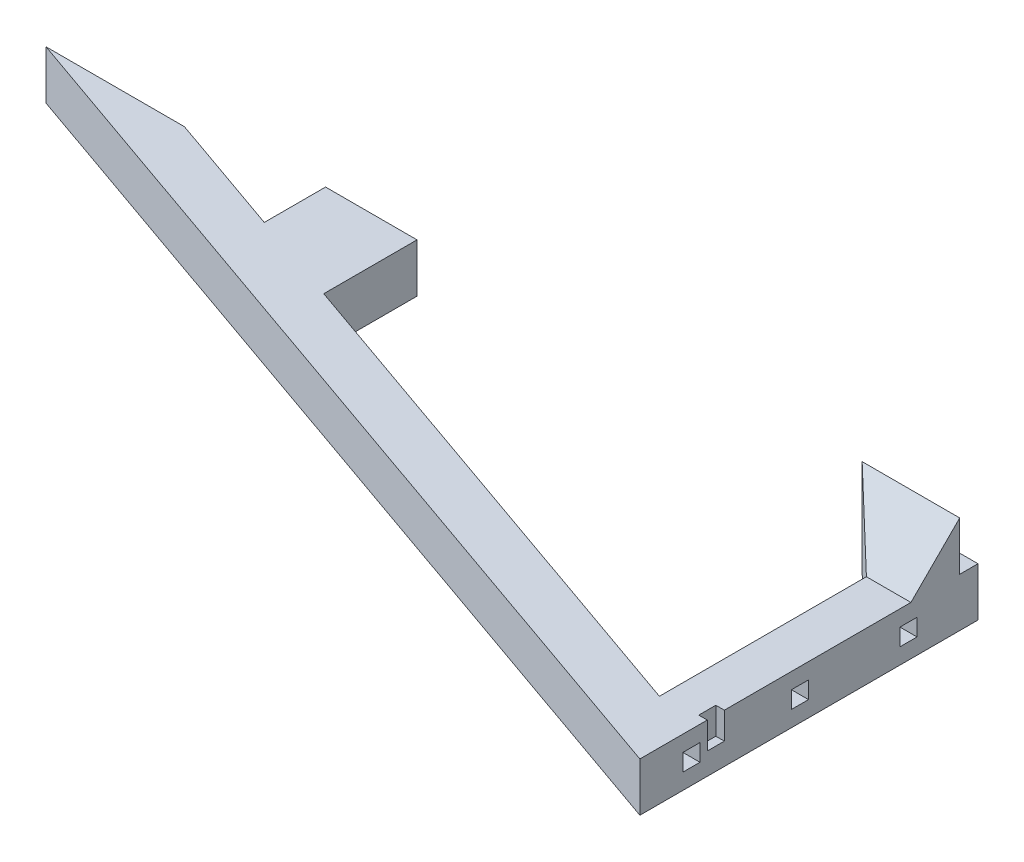
ISO-10303-21;
HEADER;
FILE_DESCRIPTION(('STEP AP214'),'2;1');
FILE_NAME('part.step','',(''),(''),'','','');
FILE_SCHEMA(('AUTOMOTIVE_DESIGN { 1 0 10303 214 1 1 1 1 }'));
ENDSEC;
DATA;
#1=APPLICATION_CONTEXT('core data for automotive mechanical design processes');
#2=APPLICATION_PROTOCOL_DEFINITION('international standard','automotive_design',2000,#1);
#3=PRODUCT_CONTEXT('',#1,'mechanical');
#4=PRODUCT('Part','Part','',(#3));
#5=PRODUCT_RELATED_PRODUCT_CATEGORY('part','',(#4));
#6=PRODUCT_DEFINITION_FORMATION('','',#4);
#7=PRODUCT_DEFINITION_CONTEXT('part definition',#1,'design');
#8=PRODUCT_DEFINITION('design','',#6,#7);
#9=PRODUCT_DEFINITION_SHAPE('','',#8);
#10=(LENGTH_UNIT() NAMED_UNIT(*) SI_UNIT(.MILLI.,.METRE.));
#11=(NAMED_UNIT(*) PLANE_ANGLE_UNIT() SI_UNIT($,.RADIAN.));
#12=(NAMED_UNIT(*) SI_UNIT($,.STERADIAN.) SOLID_ANGLE_UNIT());
#13=UNCERTAINTY_MEASURE_WITH_UNIT(LENGTH_MEASURE(1.E-05),#10,'distance_accuracy_value','');
#14=(GEOMETRIC_REPRESENTATION_CONTEXT(3) GLOBAL_UNCERTAINTY_ASSIGNED_CONTEXT((#13)) GLOBAL_UNIT_ASSIGNED_CONTEXT((#10,
#11,#12)) REPRESENTATION_CONTEXT('',''));
#15=CARTESIAN_POINT('',(0.,0.,0.));
#16=DIRECTION('',(0.,0.,1.));
#17=DIRECTION('',(1.,0.,0.));
#18=AXIS2_PLACEMENT_3D('',#15,#16,#17);
#19=CARTESIAN_POINT('',(-7.3,8.,44.9487293378726));
#20=DIRECTION('',(1.,0.,0.));
#21=DIRECTION('',(0.,0.,-1.));
#22=AXIS2_PLACEMENT_3D('',#19,#20,#21);
#23=PLANE('',#22);
#24=DIRECTION('',(0.,0.,1.));
#25=VECTOR('',#24,1.);
#26=CARTESIAN_POINT('',(-7.3,8.,44.9487293378726));
#27=LINE('',#26,#25);
#28=CARTESIAN_POINT('',(-7.3,8.,11.));
#29=VERTEX_POINT('',#28);
#30=CARTESIAN_POINT('',(-7.3,8.,44.9487293378726));
#31=VERTEX_POINT('',#30);
#32=EDGE_CURVE('E393',#29,#31,#27,.T.);
#33=ORIENTED_EDGE('',*,*,#32,.F.);
#34=DIRECTION('',(0.,-1.,0.));
#35=VECTOR('',#34,1.);
#36=CARTESIAN_POINT('',(-7.3,8.,11.));
#37=LINE('',#36,#35);
#38=CARTESIAN_POINT('',(-7.3,0.,11.));
#39=VERTEX_POINT('',#38);
#40=EDGE_CURVE('E358',#29,#39,#37,.T.);
#41=ORIENTED_EDGE('',*,*,#40,.T.);
#42=DIRECTION('',(0.,0.,1.));
#43=VECTOR('',#42,1.);
#44=CARTESIAN_POINT('',(-7.3,0.,44.9487293378726));
#45=LINE('',#44,#43);
#46=CARTESIAN_POINT('',(-7.3,0.,44.9487293378726));
#47=VERTEX_POINT('',#46);
#48=EDGE_CURVE('E420',#39,#47,#45,.T.);
#49=ORIENTED_EDGE('',*,*,#48,.T.);
#50=DIRECTION('',(0.,-1.,0.));
#51=VECTOR('',#50,1.);
#52=CARTESIAN_POINT('',(-7.3,8.,44.9487293378726));
#53=LINE('',#52,#51);
#54=EDGE_CURVE('E462',#31,#47,#53,.T.);
#55=ORIENTED_EDGE('',*,*,#54,.F.);
#56=EDGE_LOOP('',(#33,#41,#49,#55));
#57=FACE_BOUND('',#56,.T.);
#58=ADVANCED_FACE('F33',(#57),#23,.F.);
#59=CARTESIAN_POINT('',(0.,8.,0.));
#60=DIRECTION('',(0.,-1.,0.));
#61=DIRECTION('',(0.,0.,-1.));
#62=AXIS2_PLACEMENT_3D('',#59,#60,#61);
#63=PLANE('',#62);
#64=DIRECTION('',(0.,0.,-1.));
#65=VECTOR('',#64,1.);
#66=CARTESIAN_POINT('',(-92.,8.,0.));
#67=LINE('',#66,#65);
#68=CARTESIAN_POINT('',(-92.,8.,15.3023162581262));
#69=VERTEX_POINT('',#68);
#70=CARTESIAN_POINT('',(-92.,8.,0.));
#71=VERTEX_POINT('',#70);
#72=EDGE_CURVE('E400',#69,#71,#67,.T.);
#73=ORIENTED_EDGE('',*,*,#72,.T.);
#74=DIRECTION('',(-1.,0.,0.));
#75=VECTOR('',#74,1.);
#76=CARTESIAN_POINT('',(-107.,8.,0.));
#77=LINE('',#76,#75);
#78=CARTESIAN_POINT('',(-107.,8.,0.));
#79=VERTEX_POINT('',#78);
#80=EDGE_CURVE('E402',#71,#79,#77,.T.);
#81=ORIENTED_EDGE('',*,*,#80,.T.);
#82=DIRECTION('',(0.,0.,1.));
#83=VECTOR('',#82,1.);
#84=CARTESIAN_POINT('',(-107.,8.,10.0520660078759));
#85=LINE('',#84,#83);
#86=CARTESIAN_POINT('',(-107.,8.,10.0520660078759));
#87=VERTEX_POINT('',#86);
#88=EDGE_CURVE('E404',#79,#87,#85,.T.);
#89=ORIENTED_EDGE('',*,*,#88,.T.);
#90=DIRECTION('',(-0.943853446397098,0.,-0.330364452876395));
#91=VECTOR('',#90,1.);
#92=CARTESIAN_POINT('',(-127.147799643093,8.,3.));
#93=LINE('',#92,#91);
#94=CARTESIAN_POINT('',(-127.147799643093,8.,3.));
#95=VERTEX_POINT('',#94);
#96=EDGE_CURVE('E406',#87,#95,#93,.T.);
#97=ORIENTED_EDGE('',*,*,#96,.T.);
#98=DIRECTION('',(-1.,0.,0.));
#99=VECTOR('',#98,1.);
#100=CARTESIAN_POINT('',(-149.85,8.,3.));
#101=LINE('',#100,#99);
#102=CARTESIAN_POINT('',(-149.85,8.,3.));
#103=VERTEX_POINT('',#102);
#104=EDGE_CURVE('E408',#95,#103,#101,.T.);
#105=ORIENTED_EDGE('',*,*,#104,.T.);
#106=DIRECTION('',(0.943853446397098,0.,0.330364452876395));
#107=VECTOR('',#106,1.);
#108=CARTESIAN_POINT('',(0.,8.,55.45));
#109=LINE('',#108,#107);
#110=CARTESIAN_POINT('',(0.,8.,55.45));
#111=VERTEX_POINT('',#110);
#112=EDGE_CURVE('E410',#103,#111,#109,.T.);
#113=ORIENTED_EDGE('',*,*,#112,.T.);
#114=DIRECTION('',(0.,0.,-1.));
#115=VECTOR('',#114,1.);
#116=CARTESIAN_POINT('',(0.,8.,0.));
#117=LINE('',#116,#115);
#118=CARTESIAN_POINT('',(0.,8.,44.4));
#119=VERTEX_POINT('',#118);
#120=EDGE_CURVE('E413',#111,#119,#117,.T.);
#121=ORIENTED_EDGE('',*,*,#120,.T.);
#122=DIRECTION('',(1.,0.,0.));
#123=VECTOR('',#122,1.);
#124=CARTESIAN_POINT('',(-1.39999999999999,8.,44.4));
#125=LINE('',#124,#123);
#126=CARTESIAN_POINT('',(-1.39999999999999,8.,44.4));
#127=VERTEX_POINT('',#126);
#128=EDGE_CURVE('E376',#127,#119,#125,.T.);
#129=ORIENTED_EDGE('',*,*,#128,.F.);
#130=DIRECTION('',(0.,0.,1.));
#131=VECTOR('',#130,1.);
#132=CARTESIAN_POINT('',(-1.39999999999999,8.,41.6));
#133=LINE('',#132,#131);
#134=CARTESIAN_POINT('',(-1.39999999999999,8.,41.6));
#135=VERTEX_POINT('',#134);
#136=EDGE_CURVE('E361',#135,#127,#133,.T.);
#137=ORIENTED_EDGE('',*,*,#136,.F.);
#138=DIRECTION('',(-1.,0.,0.));
#139=VECTOR('',#138,1.);
#140=CARTESIAN_POINT('',(-1.39999999999999,8.,41.6));
#141=LINE('',#140,#139);
#142=CARTESIAN_POINT('',(0.,8.,41.6));
#143=VERTEX_POINT('',#142);
#144=EDGE_CURVE('E366',#143,#135,#141,.T.);
#145=ORIENTED_EDGE('',*,*,#144,.F.);
#146=CARTESIAN_POINT('',(0.,8.,11.));
#147=VERTEX_POINT('',#146);
#148=EDGE_CURVE('E417',#143,#147,#117,.T.);
#149=ORIENTED_EDGE('',*,*,#148,.T.);
#150=DIRECTION('',(-1.,0.,0.));
#151=VECTOR('',#150,1.);
#152=CARTESIAN_POINT('',(0.,8.,11.));
#153=LINE('',#152,#151);
#154=EDGE_CURVE('E355',#147,#29,#153,.T.);
#155=ORIENTED_EDGE('',*,*,#154,.T.);
#156=ORIENTED_EDGE('',*,*,#32,.T.);
#157=DIRECTION('',(-0.943853446397098,0.,-0.330364452876395));
#158=VECTOR('',#157,1.);
#159=CARTESIAN_POINT('',(-92.,8.,15.3023162581262));
#160=LINE('',#159,#158);
#161=EDGE_CURVE('E398',#31,#69,#160,.T.);
#162=ORIENTED_EDGE('',*,*,#161,.T.);
#163=EDGE_LOOP('',(#73,#81,#89,#97,#105,#113,#121,#129,#137,#145,#149,#155,#156,#162));
#164=FACE_BOUND('',#163,.T.);
#165=ADVANCED_FACE('F532',(#164),#63,.F.);
#166=CARTESIAN_POINT('',(-7.3,8.,0.));
#167=DIRECTION('',(0.,0.,1.));
#168=DIRECTION('',(1.,0.,0.));
#169=AXIS2_PLACEMENT_3D('',#166,#167,#168);
#170=PLANE('',#169);
#171=DIRECTION('',(-1.,0.,0.));
#172=VECTOR('',#171,1.);
#173=CARTESIAN_POINT('',(-7.3,0.,0.));
#174=LINE('',#173,#172);
#175=CARTESIAN_POINT('',(0.,0.,0.));
#176=VERTEX_POINT('',#175);
#177=CARTESIAN_POINT('',(-7.3,0.,0.));
#178=VERTEX_POINT('',#177);
#179=EDGE_CURVE('E382',#176,#178,#174,.T.);
#180=ORIENTED_EDGE('',*,*,#179,.T.);
#181=DIRECTION('',(0.,-1.,0.));
#182=VECTOR('',#181,1.);
#183=CARTESIAN_POINT('',(-7.3,8.,0.));
#184=LINE('',#183,#182);
#185=CARTESIAN_POINT('',(-7.3,8.,0.));
#186=VERTEX_POINT('',#185);
#187=EDGE_CURVE('E41',#186,#178,#184,.T.);
#188=ORIENTED_EDGE('',*,*,#187,.F.);
#189=DIRECTION('',(-1.,0.,0.));
#190=VECTOR('',#189,1.);
#191=CARTESIAN_POINT('',(-7.3,8.,0.));
#192=LINE('',#191,#190);
#193=CARTESIAN_POINT('',(0.,8.,0.));
#194=VERTEX_POINT('',#193);
#195=EDGE_CURVE('E390',#194,#186,#192,.T.);
#196=ORIENTED_EDGE('',*,*,#195,.F.);
#197=DIRECTION('',(0.,-1.,0.));
#198=VECTOR('',#197,1.);
#199=CARTESIAN_POINT('',(0.,8.,0.));
#200=LINE('',#199,#198);
#201=EDGE_CURVE('E416',#194,#176,#200,.T.);
#202=ORIENTED_EDGE('',*,*,#201,.T.);
#203=EDGE_LOOP('',(#180,#188,#196,#202));
#204=FACE_BOUND('',#203,.T.);
#205=ADVANCED_FACE('F35',(#204),#170,.F.);
#206=CARTESIAN_POINT('',(-7.3,0.,3.));
#207=VERTEX_POINT('',#206);
#208=EDGE_CURVE('E421',#178,#207,#45,.T.);
#209=ORIENTED_EDGE('',*,*,#208,.T.);
#210=DIRECTION('',(0.,1.,0.));
#211=VECTOR('',#210,1.);
#212=CARTESIAN_POINT('',(-7.3,8.,3.));
#213=LINE('',#212,#211);
#214=CARTESIAN_POINT('',(-7.3,8.,3.));
#215=VERTEX_POINT('',#214);
#216=EDGE_CURVE('E352',#207,#215,#213,.T.);
#217=ORIENTED_EDGE('',*,*,#216,.T.);
#218=EDGE_CURVE('E395',#186,#215,#27,.T.);
#219=ORIENTED_EDGE('',*,*,#218,.F.);
#220=ORIENTED_EDGE('',*,*,#187,.T.);
#221=EDGE_LOOP('',(#209,#217,#219,#220));
#222=FACE_BOUND('',#221,.T.);
#223=ADVANCED_FACE('F467',(#222),#23,.F.);
#224=CARTESIAN_POINT('',(-92.,8.,15.3023162581262));
#225=DIRECTION('',(-0.330364452876395,0.,0.943853446397098));
#226=DIRECTION('',(0.943853446397098,0.,0.330364452876395));
#227=AXIS2_PLACEMENT_3D('',#224,#225,#226);
#228=PLANE('',#227);
#229=DIRECTION('',(-0.943853446397098,0.,-0.330364452876395));
#230=VECTOR('',#229,1.);
#231=CARTESIAN_POINT('',(-92.,0.,15.3023162581262));
#232=LINE('',#231,#230);
#233=CARTESIAN_POINT('',(-92.,0.,15.3023162581262));
#234=VERTEX_POINT('',#233);
#235=EDGE_CURVE('E424',#47,#234,#232,.T.);
#236=ORIENTED_EDGE('',*,*,#235,.T.);
#237=DIRECTION('',(0.,-1.,0.));
#238=VECTOR('',#237,1.);
#239=CARTESIAN_POINT('',(-92.,8.,15.3023162581262));
#240=LINE('',#239,#238);
#241=EDGE_CURVE('E459',#69,#234,#240,.T.);
#242=ORIENTED_EDGE('',*,*,#241,.F.);
#243=ORIENTED_EDGE('',*,*,#161,.F.);
#244=ORIENTED_EDGE('',*,*,#54,.T.);
#245=EDGE_LOOP('',(#236,#242,#243,#244));
#246=FACE_BOUND('',#245,.T.);
#247=ADVANCED_FACE('F521',(#246),#228,.F.);
#248=CARTESIAN_POINT('',(-92.,8.,0.));
#249=DIRECTION('',(-1.,0.,0.));
#250=DIRECTION('',(0.,0.,1.));
#251=AXIS2_PLACEMENT_3D('',#248,#249,#250);
#252=PLANE('',#251);
#253=DIRECTION('',(0.,0.,-1.));
#254=VECTOR('',#253,1.);
#255=CARTESIAN_POINT('',(-92.,0.,0.));
#256=LINE('',#255,#254);
#257=CARTESIAN_POINT('',(-92.,0.,0.));
#258=VERTEX_POINT('',#257);
#259=EDGE_CURVE('E426',#234,#258,#256,.T.);
#260=ORIENTED_EDGE('',*,*,#259,.T.);
#261=DIRECTION('',(0.,-1.,0.));
#262=VECTOR('',#261,1.);
#263=CARTESIAN_POINT('',(-92.,8.,0.));
#264=LINE('',#263,#262);
#265=EDGE_CURVE('E456',#71,#258,#264,.T.);
#266=ORIENTED_EDGE('',*,*,#265,.F.);
#267=ORIENTED_EDGE('',*,*,#72,.F.);
#268=ORIENTED_EDGE('',*,*,#241,.T.);
#269=EDGE_LOOP('',(#260,#266,#267,#268));
#270=FACE_BOUND('',#269,.T.);
#271=ADVANCED_FACE('F517',(#270),#252,.F.);
#272=CARTESIAN_POINT('',(-107.,8.,0.));
#273=DIRECTION('',(0.,0.,1.));
#274=DIRECTION('',(1.,0.,0.));
#275=AXIS2_PLACEMENT_3D('',#272,#273,#274);
#276=PLANE('',#275);
#277=DIRECTION('',(-1.,0.,0.));
#278=VECTOR('',#277,1.);
#279=CARTESIAN_POINT('',(-107.,0.,0.));
#280=LINE('',#279,#278);
#281=CARTESIAN_POINT('',(-107.,0.,0.));
#282=VERTEX_POINT('',#281);
#283=EDGE_CURVE('E428',#258,#282,#280,.T.);
#284=ORIENTED_EDGE('',*,*,#283,.T.);
#285=DIRECTION('',(0.,-1.,0.));
#286=VECTOR('',#285,1.);
#287=CARTESIAN_POINT('',(-107.,8.,0.));
#288=LINE('',#287,#286);
#289=EDGE_CURVE('E453',#79,#282,#288,.T.);
#290=ORIENTED_EDGE('',*,*,#289,.F.);
#291=ORIENTED_EDGE('',*,*,#80,.F.);
#292=ORIENTED_EDGE('',*,*,#265,.T.);
#293=EDGE_LOOP('',(#284,#290,#291,#292));
#294=FACE_BOUND('',#293,.T.);
#295=ADVANCED_FACE('F512',(#294),#276,.F.);
#296=CARTESIAN_POINT('',(-107.,8.,10.0520660078759));
#297=DIRECTION('',(1.,0.,0.));
#298=DIRECTION('',(0.,0.,-1.));
#299=AXIS2_PLACEMENT_3D('',#296,#297,#298);
#300=PLANE('',#299);
#301=DIRECTION('',(0.,0.,1.));
#302=VECTOR('',#301,1.);
#303=CARTESIAN_POINT('',(-107.,0.,10.0520660078759));
#304=LINE('',#303,#302);
#305=CARTESIAN_POINT('',(-107.,0.,10.0520660078759));
#306=VERTEX_POINT('',#305);
#307=EDGE_CURVE('E430',#282,#306,#304,.T.);
#308=ORIENTED_EDGE('',*,*,#307,.T.);
#309=DIRECTION('',(0.,-1.,0.));
#310=VECTOR('',#309,1.);
#311=CARTESIAN_POINT('',(-107.,8.,10.0520660078759));
#312=LINE('',#311,#310);
#313=EDGE_CURVE('E450',#87,#306,#312,.T.);
#314=ORIENTED_EDGE('',*,*,#313,.F.);
#315=ORIENTED_EDGE('',*,*,#88,.F.);
#316=ORIENTED_EDGE('',*,*,#289,.T.);
#317=EDGE_LOOP('',(#308,#314,#315,#316));
#318=FACE_BOUND('',#317,.T.);
#319=ADVANCED_FACE('F506',(#318),#300,.F.);
#320=CARTESIAN_POINT('',(-127.147799643093,8.,3.));
#321=DIRECTION('',(-0.330364452876395,0.,0.943853446397098));
#322=DIRECTION('',(0.943853446397098,0.,0.330364452876395));
#323=AXIS2_PLACEMENT_3D('',#320,#321,#322);
#324=PLANE('',#323);
#325=DIRECTION('',(-0.943853446397098,0.,-0.330364452876395));
#326=VECTOR('',#325,1.);
#327=CARTESIAN_POINT('',(-127.147799643093,0.,3.));
#328=LINE('',#327,#326);
#329=CARTESIAN_POINT('',(-127.147799643093,0.,3.));
#330=VERTEX_POINT('',#329);
#331=EDGE_CURVE('E432',#306,#330,#328,.T.);
#332=ORIENTED_EDGE('',*,*,#331,.T.);
#333=DIRECTION('',(0.,-1.,0.));
#334=VECTOR('',#333,1.);
#335=CARTESIAN_POINT('',(-127.147799643093,8.,3.));
#336=LINE('',#335,#334);
#337=EDGE_CURVE('E447',#95,#330,#336,.T.);
#338=ORIENTED_EDGE('',*,*,#337,.F.);
#339=ORIENTED_EDGE('',*,*,#96,.F.);
#340=ORIENTED_EDGE('',*,*,#313,.T.);
#341=EDGE_LOOP('',(#332,#338,#339,#340));
#342=FACE_BOUND('',#341,.T.);
#343=ADVANCED_FACE('F502',(#342),#324,.F.);
#344=CARTESIAN_POINT('',(-149.85,8.,3.));
#345=DIRECTION('',(0.,0.,1.));
#346=DIRECTION('',(1.,0.,0.));
#347=AXIS2_PLACEMENT_3D('',#344,#345,#346);
#348=PLANE('',#347);
#349=DIRECTION('',(-1.,0.,0.));
#350=VECTOR('',#349,1.);
#351=CARTESIAN_POINT('',(-149.85,0.,3.));
#352=LINE('',#351,#350);
#353=CARTESIAN_POINT('',(-149.85,0.,3.));
#354=VERTEX_POINT('',#353);
#355=EDGE_CURVE('E434',#330,#354,#352,.T.);
#356=ORIENTED_EDGE('',*,*,#355,.T.);
#357=DIRECTION('',(0.,-1.,0.));
#358=VECTOR('',#357,1.);
#359=CARTESIAN_POINT('',(-149.85,8.,3.));
#360=LINE('',#359,#358);
#361=EDGE_CURVE('E444',#103,#354,#360,.T.);
#362=ORIENTED_EDGE('',*,*,#361,.F.);
#363=ORIENTED_EDGE('',*,*,#104,.F.);
#364=ORIENTED_EDGE('',*,*,#337,.T.);
#365=EDGE_LOOP('',(#356,#362,#363,#364));
#366=FACE_BOUND('',#365,.T.);
#367=ADVANCED_FACE('F497',(#366),#348,.F.);
#368=CARTESIAN_POINT('',(0.,8.,55.45));
#369=DIRECTION('',(0.330364452876395,0.,-0.943853446397098));
#370=DIRECTION('',(-0.943853446397098,0.,-0.330364452876395));
#371=AXIS2_PLACEMENT_3D('',#368,#369,#370);
#372=PLANE('',#371);
#373=DIRECTION('',(0.943853446397098,0.,0.330364452876395));
#374=VECTOR('',#373,1.);
#375=CARTESIAN_POINT('',(0.,0.,55.45));
#376=LINE('',#375,#374);
#377=CARTESIAN_POINT('',(0.,0.,55.45));
#378=VERTEX_POINT('',#377);
#379=EDGE_CURVE('E436',#354,#378,#376,.T.);
#380=ORIENTED_EDGE('',*,*,#379,.T.);
#381=DIRECTION('',(0.,-1.,0.));
#382=VECTOR('',#381,1.);
#383=CARTESIAN_POINT('',(0.,8.,55.45));
#384=LINE('',#383,#382);
#385=EDGE_CURVE('E441',#111,#378,#384,.T.);
#386=ORIENTED_EDGE('',*,*,#385,.F.);
#387=ORIENTED_EDGE('',*,*,#112,.F.);
#388=ORIENTED_EDGE('',*,*,#361,.T.);
#389=EDGE_LOOP('',(#380,#386,#387,#388));
#390=FACE_BOUND('',#389,.T.);
#391=ADVANCED_FACE('F491',(#390),#372,.F.);
#392=CARTESIAN_POINT('',(0.,8.,0.));
#393=DIRECTION('',(-1.,0.,0.));
#394=DIRECTION('',(0.,0.,1.));
#395=AXIS2_PLACEMENT_3D('',#392,#393,#394);
#396=PLANE('',#395);
#397=DIRECTION('',(0.,0.,-1.));
#398=VECTOR('',#397,1.);
#399=CARTESIAN_POINT('',(0.,2.6,48.4));
#400=LINE('',#399,#398);
#401=CARTESIAN_POINT('',(0.,2.6,48.4));
#402=VERTEX_POINT('',#401);
#403=CARTESIAN_POINT('',(0.,2.6,45.6));
#404=VERTEX_POINT('',#403);
#405=EDGE_CURVE('E262',#402,#404,#400,.T.);
#406=ORIENTED_EDGE('',*,*,#405,.F.);
#407=DIRECTION('',(0.,-1.,0.));
#408=VECTOR('',#407,1.);
#409=CARTESIAN_POINT('',(0.,5.4,48.4));
#410=LINE('',#409,#408);
#411=CARTESIAN_POINT('',(0.,5.4,48.4));
#412=VERTEX_POINT('',#411);
#413=EDGE_CURVE('E48',#412,#402,#410,.T.);
#414=ORIENTED_EDGE('',*,*,#413,.F.);
#415=DIRECTION('',(0.,0.,1.));
#416=VECTOR('',#415,1.);
#417=CARTESIAN_POINT('',(0.,5.4,48.4));
#418=LINE('',#417,#416);
#419=CARTESIAN_POINT('',(0.,5.4,45.6));
#420=VERTEX_POINT('',#419);
#421=EDGE_CURVE('E253',#420,#412,#418,.T.);
#422=ORIENTED_EDGE('',*,*,#421,.F.);
#423=DIRECTION('',(0.,1.,0.));
#424=VECTOR('',#423,1.);
#425=CARTESIAN_POINT('',(0.,5.4,45.6));
#426=LINE('',#425,#424);
#427=EDGE_CURVE('E256',#404,#420,#426,.T.);
#428=ORIENTED_EDGE('',*,*,#427,.F.);
#429=EDGE_LOOP('',(#406,#414,#422,#428));
#430=FACE_BOUND('',#429,.T.);
#431=DIRECTION('',(0.,0.,-1.));
#432=VECTOR('',#431,1.);
#433=CARTESIAN_POINT('',(0.,2.6,30.6));
#434=LINE('',#433,#432);
#435=CARTESIAN_POINT('',(0.,2.6,30.6));
#436=VERTEX_POINT('',#435);
#437=CARTESIAN_POINT('',(0.,2.6,27.8));
#438=VERTEX_POINT('',#437);
#439=EDGE_CURVE('E288',#436,#438,#434,.T.);
#440=ORIENTED_EDGE('',*,*,#439,.F.);
#441=DIRECTION('',(0.,-1.,0.));
#442=VECTOR('',#441,1.);
#443=CARTESIAN_POINT('',(0.,5.4,30.6));
#444=LINE('',#443,#442);
#445=CARTESIAN_POINT('',(0.,5.4,30.6));
#446=VERTEX_POINT('',#445);
#447=EDGE_CURVE('E56',#446,#436,#444,.T.);
#448=ORIENTED_EDGE('',*,*,#447,.F.);
#449=DIRECTION('',(0.,0.,1.));
#450=VECTOR('',#449,1.);
#451=CARTESIAN_POINT('',(0.,5.4,30.6));
#452=LINE('',#451,#450);
#453=CARTESIAN_POINT('',(0.,5.4,27.8));
#454=VERTEX_POINT('',#453);
#455=EDGE_CURVE('E277',#454,#446,#452,.T.);
#456=ORIENTED_EDGE('',*,*,#455,.F.);
#457=DIRECTION('',(0.,1.,0.));
#458=VECTOR('',#457,1.);
#459=CARTESIAN_POINT('',(0.,5.4,27.8));
#460=LINE('',#459,#458);
#461=EDGE_CURVE('E292',#438,#454,#460,.T.);
#462=ORIENTED_EDGE('',*,*,#461,.F.);
#463=EDGE_LOOP('',(#440,#448,#456,#462));
#464=FACE_BOUND('',#463,.T.);
#465=DIRECTION('',(0.,0.,-1.));
#466=VECTOR('',#465,1.);
#467=CARTESIAN_POINT('',(0.,2.6,12.8));
#468=LINE('',#467,#466);
#469=CARTESIAN_POINT('',(0.,2.6,12.8));
#470=VERTEX_POINT('',#469);
#471=CARTESIAN_POINT('',(0.,2.6,10.));
#472=VERTEX_POINT('',#471);
#473=EDGE_CURVE('E319',#470,#472,#468,.T.);
#474=ORIENTED_EDGE('',*,*,#473,.F.);
#475=DIRECTION('',(0.,-1.,0.));
#476=VECTOR('',#475,1.);
#477=CARTESIAN_POINT('',(0.,5.4,12.8));
#478=LINE('',#477,#476);
#479=CARTESIAN_POINT('',(0.,5.4,12.8));
#480=VERTEX_POINT('',#479);
#481=EDGE_CURVE('E317',#480,#470,#478,.T.);
#482=ORIENTED_EDGE('',*,*,#481,.F.);
#483=DIRECTION('',(0.,0.,1.));
#484=VECTOR('',#483,1.);
#485=CARTESIAN_POINT('',(0.,5.4,12.8));
#486=LINE('',#485,#484);
#487=CARTESIAN_POINT('',(0.,5.4,10.));
#488=VERTEX_POINT('',#487);
#489=EDGE_CURVE('E307',#488,#480,#486,.T.);
#490=ORIENTED_EDGE('',*,*,#489,.F.);
#491=DIRECTION('',(0.,1.,0.));
#492=VECTOR('',#491,1.);
#493=CARTESIAN_POINT('',(0.,5.4,10.));
#494=LINE('',#493,#492);
#495=EDGE_CURVE('E322',#472,#488,#494,.T.);
#496=ORIENTED_EDGE('',*,*,#495,.F.);
#497=EDGE_LOOP('',(#474,#482,#490,#496));
#498=FACE_BOUND('',#497,.T.);
#499=DIRECTION('',(0.,1.,0.));
#500=VECTOR('',#499,1.);
#501=CARTESIAN_POINT('',(0.,0.,3.));
#502=LINE('',#501,#500);
#503=CARTESIAN_POINT('',(0.,8.,3.));
#504=VERTEX_POINT('',#503);
#505=CARTESIAN_POINT('',(0.,16.,3.));
#506=VERTEX_POINT('',#505);
#507=EDGE_CURVE('E341',#504,#506,#502,.T.);
#508=ORIENTED_EDGE('',*,*,#507,.T.);
#509=DIRECTION('',(0.,0.707106781186548,-0.707106781186548));
#510=VECTOR('',#509,1.);
#511=CARTESIAN_POINT('',(0.,16.,3.));
#512=LINE('',#511,#510);
#513=EDGE_CURVE('E335',#147,#506,#512,.T.);
#514=ORIENTED_EDGE('',*,*,#513,.F.);
#515=ORIENTED_EDGE('',*,*,#148,.F.);
#516=DIRECTION('',(0.,1.,0.));
#517=VECTOR('',#516,1.);
#518=CARTESIAN_POINT('',(0.,3.6,41.6));
#519=LINE('',#518,#517);
#520=CARTESIAN_POINT('',(0.,3.6,41.6));
#521=VERTEX_POINT('',#520);
#522=EDGE_CURVE('E383',#521,#143,#519,.T.);
#523=ORIENTED_EDGE('',*,*,#522,.F.);
#524=DIRECTION('',(0.,0.,-1.));
#525=VECTOR('',#524,1.);
#526=CARTESIAN_POINT('',(0.,3.6,41.6));
#527=LINE('',#526,#525);
#528=CARTESIAN_POINT('',(0.,3.6,44.4));
#529=VERTEX_POINT('',#528);
#530=EDGE_CURVE('E369',#529,#521,#527,.T.);
#531=ORIENTED_EDGE('',*,*,#530,.F.);
#532=DIRECTION('',(0.,1.,0.));
#533=VECTOR('',#532,1.);
#534=CARTESIAN_POINT('',(0.,3.6,44.4));
#535=LINE('',#534,#533);
#536=EDGE_CURVE('E385',#529,#119,#535,.T.);
#537=ORIENTED_EDGE('',*,*,#536,.T.);
#538=ORIENTED_EDGE('',*,*,#120,.F.);
#539=ORIENTED_EDGE('',*,*,#385,.T.);
#540=DIRECTION('',(0.,0.,-1.));
#541=VECTOR('',#540,1.);
#542=CARTESIAN_POINT('',(0.,0.,0.));
#543=LINE('',#542,#541);
#544=EDGE_CURVE('E394',#378,#176,#543,.T.);
#545=ORIENTED_EDGE('',*,*,#544,.T.);
#546=ORIENTED_EDGE('',*,*,#201,.F.);
#547=EDGE_CURVE('E412',#504,#194,#117,.T.);
#548=ORIENTED_EDGE('',*,*,#547,.F.);
#549=EDGE_LOOP('',(#508,#514,#515,#523,#531,#537,#538,#539,#545,#546,#548));
#550=FACE_BOUND('',#549,.T.);
#551=ADVANCED_FACE('F486',(#430,#464,#498,#550),#396,.F.);
#552=ORIENTED_EDGE('',*,*,#218,.T.);
#553=DIRECTION('',(1.,0.,0.));
#554=VECTOR('',#553,1.);
#555=CARTESIAN_POINT('',(0.,8.,3.));
#556=LINE('',#555,#554);
#557=EDGE_CURVE('E347',#215,#504,#556,.T.);
#558=ORIENTED_EDGE('',*,*,#557,.T.);
#559=ORIENTED_EDGE('',*,*,#547,.T.);
#560=ORIENTED_EDGE('',*,*,#195,.T.);
#561=EDGE_LOOP('',(#552,#558,#559,#560));
#562=FACE_BOUND('',#561,.T.);
#563=ADVANCED_FACE('F483',(#562),#63,.F.);
#564=CARTESIAN_POINT('',(0.,0.,0.));
#565=DIRECTION('',(0.,-1.,0.));
#566=DIRECTION('',(0.,0.,-1.));
#567=AXIS2_PLACEMENT_3D('',#564,#565,#566);
#568=PLANE('',#567);
#569=DIRECTION('',(0.736099620693866,0.,0.676873214431142));
#570=VECTOR('',#569,1.);
#571=CARTESIAN_POINT('',(-7.3,0.,11.));
#572=LINE('',#571,#570);
#573=CARTESIAN_POINT('',(-16.,0.,3.));
#574=VERTEX_POINT('',#573);
#575=EDGE_CURVE('E269',#574,#39,#572,.T.);
#576=ORIENTED_EDGE('',*,*,#575,.F.);
#577=DIRECTION('',(-1.,0.,0.));
#578=VECTOR('',#577,1.);
#579=CARTESIAN_POINT('',(0.,0.,3.));
#580=LINE('',#579,#578);
#581=EDGE_CURVE('E338',#207,#574,#580,.T.);
#582=ORIENTED_EDGE('',*,*,#581,.F.);
#583=ORIENTED_EDGE('',*,*,#208,.F.);
#584=ORIENTED_EDGE('',*,*,#179,.F.);
#585=ORIENTED_EDGE('',*,*,#544,.F.);
#586=ORIENTED_EDGE('',*,*,#379,.F.);
#587=ORIENTED_EDGE('',*,*,#355,.F.);
#588=ORIENTED_EDGE('',*,*,#331,.F.);
#589=ORIENTED_EDGE('',*,*,#307,.F.);
#590=ORIENTED_EDGE('',*,*,#283,.F.);
#591=ORIENTED_EDGE('',*,*,#259,.F.);
#592=ORIENTED_EDGE('',*,*,#235,.F.);
#593=ORIENTED_EDGE('',*,*,#48,.F.);
#594=EDGE_LOOP('',(#576,#582,#583,#584,#585,#586,#587,#588,#589,#590,#591,#592,#593));
#595=FACE_BOUND('',#594,.T.);
#596=ADVANCED_FACE('F475',(#595),#568,.T.);
#597=CARTESIAN_POINT('',(-1.39999999999999,3.6,41.6));
#598=DIRECTION('',(-1.,0.,0.));
#599=DIRECTION('',(0.,0.,1.));
#600=AXIS2_PLACEMENT_3D('',#597,#598,#599);
#601=PLANE('',#600);
#602=ORIENTED_EDGE('',*,*,#136,.T.);
#603=DIRECTION('',(0.,1.,0.));
#604=VECTOR('',#603,1.);
#605=CARTESIAN_POINT('',(-1.39999999999999,3.6,44.4));
#606=LINE('',#605,#604);
#607=CARTESIAN_POINT('',(-1.39999999999999,3.6,44.4));
#608=VERTEX_POINT('',#607);
#609=EDGE_CURVE('E374',#608,#127,#606,.T.);
#610=ORIENTED_EDGE('',*,*,#609,.F.);
#611=DIRECTION('',(0.,0.,1.));
#612=VECTOR('',#611,1.);
#613=CARTESIAN_POINT('',(-1.39999999999999,3.6,41.6));
#614=LINE('',#613,#612);
#615=CARTESIAN_POINT('',(-1.39999999999999,3.6,41.6));
#616=VERTEX_POINT('',#615);
#617=EDGE_CURVE('E362',#616,#608,#614,.T.);
#618=ORIENTED_EDGE('',*,*,#617,.F.);
#619=DIRECTION('',(0.,1.,0.));
#620=VECTOR('',#619,1.);
#621=CARTESIAN_POINT('',(-1.39999999999999,3.6,41.6));
#622=LINE('',#621,#620);
#623=EDGE_CURVE('E380',#616,#135,#622,.T.);
#624=ORIENTED_EDGE('',*,*,#623,.T.);
#625=EDGE_LOOP('',(#602,#610,#618,#624));
#626=FACE_BOUND('',#625,.T.);
#627=ADVANCED_FACE('F549',(#626),#601,.F.);
#628=CARTESIAN_POINT('',(-1.39999999999999,3.6,41.6));
#629=DIRECTION('',(0.,0.,-1.));
#630=DIRECTION('',(-1.,0.,0.));
#631=AXIS2_PLACEMENT_3D('',#628,#629,#630);
#632=PLANE('',#631);
#633=ORIENTED_EDGE('',*,*,#144,.T.);
#634=ORIENTED_EDGE('',*,*,#623,.F.);
#635=DIRECTION('',(-1.,0.,0.));
#636=VECTOR('',#635,1.);
#637=CARTESIAN_POINT('',(-1.39999999999999,3.6,41.6));
#638=LINE('',#637,#636);
#639=EDGE_CURVE('E371',#521,#616,#638,.T.);
#640=ORIENTED_EDGE('',*,*,#639,.F.);
#641=ORIENTED_EDGE('',*,*,#522,.T.);
#642=EDGE_LOOP('',(#633,#634,#640,#641));
#643=FACE_BOUND('',#642,.T.);
#644=ADVANCED_FACE('F540',(#643),#632,.F.);
#645=CARTESIAN_POINT('',(-1.39999999999999,3.6,44.4));
#646=DIRECTION('',(0.,0.,1.));
#647=DIRECTION('',(1.,0.,0.));
#648=AXIS2_PLACEMENT_3D('',#645,#646,#647);
#649=PLANE('',#648);
#650=ORIENTED_EDGE('',*,*,#128,.T.);
#651=ORIENTED_EDGE('',*,*,#536,.F.);
#652=DIRECTION('',(1.,0.,0.));
#653=VECTOR('',#652,1.);
#654=CARTESIAN_POINT('',(-1.39999999999999,3.6,44.4));
#655=LINE('',#654,#653);
#656=EDGE_CURVE('E365',#608,#529,#655,.T.);
#657=ORIENTED_EDGE('',*,*,#656,.F.);
#658=ORIENTED_EDGE('',*,*,#609,.T.);
#659=EDGE_LOOP('',(#650,#651,#657,#658));
#660=FACE_BOUND('',#659,.T.);
#661=ADVANCED_FACE('F546',(#660),#649,.F.);
#662=CARTESIAN_POINT('',(0.,3.6,0.));
#663=DIRECTION('',(0.,1.,0.));
#664=DIRECTION('',(0.,0.,1.));
#665=AXIS2_PLACEMENT_3D('',#662,#663,#664);
#666=PLANE('',#665);
#667=ORIENTED_EDGE('',*,*,#617,.T.);
#668=ORIENTED_EDGE('',*,*,#656,.T.);
#669=ORIENTED_EDGE('',*,*,#530,.T.);
#670=ORIENTED_EDGE('',*,*,#639,.T.);
#671=EDGE_LOOP('',(#667,#668,#669,#670));
#672=FACE_BOUND('',#671,.T.);
#673=ADVANCED_FACE('F543',(#672),#666,.T.);
#674=CARTESIAN_POINT('',(0.,0.,3.));
#675=DIRECTION('',(0.,0.,-1.));
#676=DIRECTION('',(-1.,0.,0.));
#677=AXIS2_PLACEMENT_3D('',#674,#675,#676);
#678=PLANE('',#677);
#679=ORIENTED_EDGE('',*,*,#216,.F.);
#680=ORIENTED_EDGE('',*,*,#581,.T.);
#681=DIRECTION('',(0.,1.,0.));
#682=VECTOR('',#681,1.);
#683=CARTESIAN_POINT('',(-16.,0.,3.));
#684=LINE('',#683,#682);
#685=CARTESIAN_POINT('',(-16.,16.,3.));
#686=VERTEX_POINT('',#685);
#687=EDGE_CURVE('E344',#574,#686,#684,.T.);
#688=ORIENTED_EDGE('',*,*,#687,.T.);
#689=DIRECTION('',(-1.,0.,0.));
#690=VECTOR('',#689,1.);
#691=CARTESIAN_POINT('',(0.,16.,3.));
#692=LINE('',#691,#690);
#693=EDGE_CURVE('E337',#506,#686,#692,.T.);
#694=ORIENTED_EDGE('',*,*,#693,.F.);
#695=ORIENTED_EDGE('',*,*,#507,.F.);
#696=ORIENTED_EDGE('',*,*,#557,.F.);
#697=EDGE_LOOP('',(#679,#680,#688,#694,#695,#696));
#698=FACE_BOUND('',#697,.T.);
#699=ADVANCED_FACE('F480',(#698),#678,.T.);
#700=CARTESIAN_POINT('',(-149.85,16.,3.00000000000002));
#701=DIRECTION('',(0.,-0.707106781186548,-0.707106781186548));
#702=DIRECTION('',(0.,0.707106781186548,-0.707106781186548));
#703=AXIS2_PLACEMENT_3D('',#700,#701,#702);
#704=PLANE('',#703);
#705=ORIENTED_EDGE('',*,*,#693,.T.);
#706=DIRECTION('',(0.609585177852037,-0.560538094576587,0.560538094576586));
#707=VECTOR('',#706,1.);
#708=CARTESIAN_POINT('',(-65.737868820266,61.7359713289803,-42.7359713289803));
#709=LINE('',#708,#707);
#710=EDGE_CURVE('E11',#686,#29,#709,.T.);
#711=ORIENTED_EDGE('',*,*,#710,.T.);
#712=ORIENTED_EDGE('',*,*,#154,.F.);
#713=ORIENTED_EDGE('',*,*,#513,.T.);
#714=EDGE_LOOP('',(#705,#711,#712,#713));
#715=FACE_BOUND('',#714,.T.);
#716=ADVANCED_FACE('F528',(#715),#704,.F.);
#717=CARTESIAN_POINT('',(-7.3,16.,11.));
#718=DIRECTION('',(0.676873214431142,0.,-0.736099620693866));
#719=DIRECTION('',(-0.736099620693866,0.,-0.676873214431142));
#720=AXIS2_PLACEMENT_3D('',#717,#718,#719);
#721=PLANE('',#720);
#722=ORIENTED_EDGE('',*,*,#687,.F.);
#723=ORIENTED_EDGE('',*,*,#575,.T.);
#724=ORIENTED_EDGE('',*,*,#40,.F.);
#725=ORIENTED_EDGE('',*,*,#710,.F.);
#726=EDGE_LOOP('',(#722,#723,#724,#725));
#727=FACE_BOUND('',#726,.T.);
#728=ADVANCED_FACE('F526',(#727),#721,.F.);
#729=CARTESIAN_POINT('',(-4.4,5.4,12.8));
#730=DIRECTION('',(0.,0.,1.));
#731=DIRECTION('',(0.,-1.,0.));
#732=AXIS2_PLACEMENT_3D('',#729,#730,#731);
#733=PLANE('',#732);
#734=ORIENTED_EDGE('',*,*,#481,.T.);
#735=DIRECTION('',(1.,0.,0.));
#736=VECTOR('',#735,1.);
#737=CARTESIAN_POINT('',(-4.4,2.6,12.8));
#738=LINE('',#737,#736);
#739=CARTESIAN_POINT('',(-4.4,2.6,12.8));
#740=VERTEX_POINT('',#739);
#741=EDGE_CURVE('E316',#740,#470,#738,.T.);
#742=ORIENTED_EDGE('',*,*,#741,.F.);
#743=DIRECTION('',(0.,-1.,0.));
#744=VECTOR('',#743,1.);
#745=CARTESIAN_POINT('',(-4.4,5.4,12.8));
#746=LINE('',#745,#744);
#747=CARTESIAN_POINT('',(-4.4,5.4,12.8));
#748=VERTEX_POINT('',#747);
#749=EDGE_CURVE('E303',#748,#740,#746,.T.);
#750=ORIENTED_EDGE('',*,*,#749,.F.);
#751=DIRECTION('',(1.,0.,0.));
#752=VECTOR('',#751,1.);
#753=CARTESIAN_POINT('',(-4.4,5.4,12.8));
#754=LINE('',#753,#752);
#755=EDGE_CURVE('E289',#748,#480,#754,.T.);
#756=ORIENTED_EDGE('',*,*,#755,.T.);
#757=EDGE_LOOP('',(#734,#742,#750,#756));
#758=FACE_BOUND('',#757,.T.);
#759=ADVANCED_FACE('F616',(#758),#733,.F.);
#760=CARTESIAN_POINT('',(-4.4,5.4,12.8));
#761=DIRECTION('',(0.,1.,0.));
#762=DIRECTION('',(0.,0.,1.));
#763=AXIS2_PLACEMENT_3D('',#760,#761,#762);
#764=PLANE('',#763);
#765=ORIENTED_EDGE('',*,*,#489,.T.);
#766=ORIENTED_EDGE('',*,*,#755,.F.);
#767=DIRECTION('',(0.,0.,1.));
#768=VECTOR('',#767,1.);
#769=CARTESIAN_POINT('',(-4.4,5.4,12.8));
#770=LINE('',#769,#768);
#771=CARTESIAN_POINT('',(-4.4,5.4,10.));
#772=VERTEX_POINT('',#771);
#773=EDGE_CURVE('E313',#772,#748,#770,.T.);
#774=ORIENTED_EDGE('',*,*,#773,.F.);
#775=DIRECTION('',(1.,0.,0.));
#776=VECTOR('',#775,1.);
#777=CARTESIAN_POINT('',(-4.4,5.4,10.));
#778=LINE('',#777,#776);
#779=EDGE_CURVE('E328',#772,#488,#778,.T.);
#780=ORIENTED_EDGE('',*,*,#779,.T.);
#781=EDGE_LOOP('',(#765,#766,#774,#780));
#782=FACE_BOUND('',#781,.T.);
#783=ADVANCED_FACE('F635',(#782),#764,.F.);
#784=CARTESIAN_POINT('',(-4.4,5.4,10.));
#785=DIRECTION('',(0.,0.,-1.));
#786=DIRECTION('',(-1.,0.,0.));
#787=AXIS2_PLACEMENT_3D('',#784,#785,#786);
#788=PLANE('',#787);
#789=ORIENTED_EDGE('',*,*,#495,.T.);
#790=ORIENTED_EDGE('',*,*,#779,.F.);
#791=DIRECTION('',(0.,1.,0.));
#792=VECTOR('',#791,1.);
#793=CARTESIAN_POINT('',(-4.4,5.4,10.));
#794=LINE('',#793,#792);
#795=CARTESIAN_POINT('',(-4.4,2.6,10.));
#796=VERTEX_POINT('',#795);
#797=EDGE_CURVE('E310',#796,#772,#794,.T.);
#798=ORIENTED_EDGE('',*,*,#797,.F.);
#799=DIRECTION('',(1.,0.,0.));
#800=VECTOR('',#799,1.);
#801=CARTESIAN_POINT('',(-4.4,2.6,10.));
#802=LINE('',#801,#800);
#803=EDGE_CURVE('E330',#796,#472,#802,.T.);
#804=ORIENTED_EDGE('',*,*,#803,.T.);
#805=EDGE_LOOP('',(#789,#790,#798,#804));
#806=FACE_BOUND('',#805,.T.);
#807=ADVANCED_FACE('F645',(#806),#788,.F.);
#808=CARTESIAN_POINT('',(-4.4,2.6,12.8));
#809=DIRECTION('',(0.,-1.,0.));
#810=DIRECTION('',(0.,0.,-1.));
#811=AXIS2_PLACEMENT_3D('',#808,#809,#810);
#812=PLANE('',#811);
#813=ORIENTED_EDGE('',*,*,#473,.T.);
#814=ORIENTED_EDGE('',*,*,#803,.F.);
#815=DIRECTION('',(0.,0.,-1.));
#816=VECTOR('',#815,1.);
#817=CARTESIAN_POINT('',(-4.4,2.6,12.8));
#818=LINE('',#817,#816);
#819=EDGE_CURVE('E306',#740,#796,#818,.T.);
#820=ORIENTED_EDGE('',*,*,#819,.F.);
#821=ORIENTED_EDGE('',*,*,#741,.T.);
#822=EDGE_LOOP('',(#813,#814,#820,#821));
#823=FACE_BOUND('',#822,.T.);
#824=ADVANCED_FACE('F655',(#823),#812,.F.);
#825=CARTESIAN_POINT('',(-4.4,0.,0.));
#826=DIRECTION('',(1.,0.,0.));
#827=DIRECTION('',(0.,0.,-1.));
#828=AXIS2_PLACEMENT_3D('',#825,#826,#827);
#829=PLANE('',#828);
#830=ORIENTED_EDGE('',*,*,#749,.T.);
#831=ORIENTED_EDGE('',*,*,#819,.T.);
#832=ORIENTED_EDGE('',*,*,#797,.T.);
#833=ORIENTED_EDGE('',*,*,#773,.T.);
#834=EDGE_LOOP('',(#830,#831,#832,#833));
#835=FACE_BOUND('',#834,.T.);
#836=ADVANCED_FACE('F665',(#835),#829,.T.);
#837=CARTESIAN_POINT('',(-4.4,5.4,30.6));
#838=DIRECTION('',(0.,0.,1.));
#839=DIRECTION('',(1.,0.,0.));
#840=AXIS2_PLACEMENT_3D('',#837,#838,#839);
#841=PLANE('',#840);
#842=ORIENTED_EDGE('',*,*,#447,.T.);
#843=DIRECTION('',(1.,0.,0.));
#844=VECTOR('',#843,1.);
#845=CARTESIAN_POINT('',(-4.4,2.6,30.6));
#846=LINE('',#845,#844);
#847=CARTESIAN_POINT('',(-4.4,2.6,30.6));
#848=VERTEX_POINT('',#847);
#849=EDGE_CURVE('E286',#848,#436,#846,.T.);
#850=ORIENTED_EDGE('',*,*,#849,.F.);
#851=DIRECTION('',(0.,-1.,0.));
#852=VECTOR('',#851,1.);
#853=CARTESIAN_POINT('',(-4.4,5.4,30.6));
#854=LINE('',#853,#852);
#855=CARTESIAN_POINT('',(-4.4,5.4,30.6));
#856=VERTEX_POINT('',#855);
#857=EDGE_CURVE('E273',#856,#848,#854,.T.);
#858=ORIENTED_EDGE('',*,*,#857,.F.);
#859=DIRECTION('',(1.,0.,0.));
#860=VECTOR('',#859,1.);
#861=CARTESIAN_POINT('',(-4.4,5.4,30.6));
#862=LINE('',#861,#860);
#863=EDGE_CURVE('E263',#856,#446,#862,.T.);
#864=ORIENTED_EDGE('',*,*,#863,.T.);
#865=EDGE_LOOP('',(#842,#850,#858,#864));
#866=FACE_BOUND('',#865,.T.);
#867=ADVANCED_FACE('F675',(#866),#841,.F.);
#868=CARTESIAN_POINT('',(-4.4,5.4,30.6));
#869=DIRECTION('',(0.,1.,0.));
#870=DIRECTION('',(0.,0.,1.));
#871=AXIS2_PLACEMENT_3D('',#868,#869,#870);
#872=PLANE('',#871);
#873=ORIENTED_EDGE('',*,*,#455,.T.);
#874=ORIENTED_EDGE('',*,*,#863,.F.);
#875=DIRECTION('',(0.,0.,1.));
#876=VECTOR('',#875,1.);
#877=CARTESIAN_POINT('',(-4.4,5.4,30.6));
#878=LINE('',#877,#876);
#879=CARTESIAN_POINT('',(-4.4,5.4,27.8));
#880=VERTEX_POINT('',#879);
#881=EDGE_CURVE('E283',#880,#856,#878,.T.);
#882=ORIENTED_EDGE('',*,*,#881,.F.);
#883=DIRECTION('',(1.,0.,0.));
#884=VECTOR('',#883,1.);
#885=CARTESIAN_POINT('',(-4.4,5.4,27.8));
#886=LINE('',#885,#884);
#887=EDGE_CURVE('E298',#880,#454,#886,.T.);
#888=ORIENTED_EDGE('',*,*,#887,.T.);
#889=EDGE_LOOP('',(#873,#874,#882,#888));
#890=FACE_BOUND('',#889,.T.);
#891=ADVANCED_FACE('F685',(#890),#872,.F.);
#892=CARTESIAN_POINT('',(-4.4,5.4,27.8));
#893=DIRECTION('',(0.,0.,-1.));
#894=DIRECTION('',(0.,1.,0.));
#895=AXIS2_PLACEMENT_3D('',#892,#893,#894);
#896=PLANE('',#895);
#897=ORIENTED_EDGE('',*,*,#461,.T.);
#898=ORIENTED_EDGE('',*,*,#887,.F.);
#899=DIRECTION('',(0.,1.,0.));
#900=VECTOR('',#899,1.);
#901=CARTESIAN_POINT('',(-4.4,5.4,27.8));
#902=LINE('',#901,#900);
#903=CARTESIAN_POINT('',(-4.4,2.6,27.8));
#904=VERTEX_POINT('',#903);
#905=EDGE_CURVE('E280',#904,#880,#902,.T.);
#906=ORIENTED_EDGE('',*,*,#905,.F.);
#907=DIRECTION('',(1.,0.,0.));
#908=VECTOR('',#907,1.);
#909=CARTESIAN_POINT('',(-4.4,2.6,27.8));
#910=LINE('',#909,#908);
#911=EDGE_CURVE('E300',#904,#438,#910,.T.);
#912=ORIENTED_EDGE('',*,*,#911,.T.);
#913=EDGE_LOOP('',(#897,#898,#906,#912));
#914=FACE_BOUND('',#913,.T.);
#915=ADVANCED_FACE('F694',(#914),#896,.F.);
#916=CARTESIAN_POINT('',(-4.4,2.6,30.6));
#917=DIRECTION('',(0.,-1.,0.));
#918=DIRECTION('',(0.,0.,-1.));
#919=AXIS2_PLACEMENT_3D('',#916,#917,#918);
#920=PLANE('',#919);
#921=ORIENTED_EDGE('',*,*,#439,.T.);
#922=ORIENTED_EDGE('',*,*,#911,.F.);
#923=DIRECTION('',(0.,0.,-1.));
#924=VECTOR('',#923,1.);
#925=CARTESIAN_POINT('',(-4.4,2.6,30.6));
#926=LINE('',#925,#924);
#927=EDGE_CURVE('E276',#848,#904,#926,.T.);
#928=ORIENTED_EDGE('',*,*,#927,.F.);
#929=ORIENTED_EDGE('',*,*,#849,.T.);
#930=EDGE_LOOP('',(#921,#922,#928,#929));
#931=FACE_BOUND('',#930,.T.);
#932=ADVANCED_FACE('F704',(#931),#920,.F.);
#933=CARTESIAN_POINT('',(-4.4,0.,0.));
#934=DIRECTION('',(1.,0.,0.));
#935=DIRECTION('',(0.,0.,-1.));
#936=AXIS2_PLACEMENT_3D('',#933,#934,#935);
#937=PLANE('',#936);
#938=ORIENTED_EDGE('',*,*,#857,.T.);
#939=ORIENTED_EDGE('',*,*,#927,.T.);
#940=ORIENTED_EDGE('',*,*,#905,.T.);
#941=ORIENTED_EDGE('',*,*,#881,.T.);
#942=EDGE_LOOP('',(#938,#939,#940,#941));
#943=FACE_BOUND('',#942,.T.);
#944=ADVANCED_FACE('F714',(#943),#937,.T.);
#945=CARTESIAN_POINT('',(-4.39999999999999,5.4,48.4));
#946=DIRECTION('',(0.,0.,1.));
#947=DIRECTION('',(1.,0.,0.));
#948=AXIS2_PLACEMENT_3D('',#945,#946,#947);
#949=PLANE('',#948);
#950=ORIENTED_EDGE('',*,*,#413,.T.);
#951=DIRECTION('',(1.,0.,0.));
#952=VECTOR('',#951,1.);
#953=CARTESIAN_POINT('',(-4.39999999999999,2.6,48.4));
#954=LINE('',#953,#952);
#955=CARTESIAN_POINT('',(-4.39999999999999,2.6,48.4));
#956=VERTEX_POINT('',#955);
#957=EDGE_CURVE('E231',#956,#402,#954,.T.);
#958=ORIENTED_EDGE('',*,*,#957,.F.);
#959=DIRECTION('',(0.,-1.,0.));
#960=VECTOR('',#959,1.);
#961=CARTESIAN_POINT('',(-4.39999999999999,5.4,48.4));
#962=LINE('',#961,#960);
#963=CARTESIAN_POINT('',(-4.39999999999999,5.4,48.4));
#964=VERTEX_POINT('',#963);
#965=EDGE_CURVE('E235',#964,#956,#962,.T.);
#966=ORIENTED_EDGE('',*,*,#965,.F.);
#967=DIRECTION('',(1.,0.,0.));
#968=VECTOR('',#967,1.);
#969=CARTESIAN_POINT('',(-4.39999999999999,5.4,48.4));
#970=LINE('',#969,#968);
#971=EDGE_CURVE('E267',#964,#412,#970,.T.);
#972=ORIENTED_EDGE('',*,*,#971,.T.);
#973=EDGE_LOOP('',(#950,#958,#966,#972));
#974=FACE_BOUND('',#973,.T.);
#975=ADVANCED_FACE('F233',(#974),#949,.F.);
#976=CARTESIAN_POINT('',(-4.39999999999999,5.4,48.4));
#977=DIRECTION('',(0.,1.,0.));
#978=DIRECTION('',(0.,0.,1.));
#979=AXIS2_PLACEMENT_3D('',#976,#977,#978);
#980=PLANE('',#979);
#981=ORIENTED_EDGE('',*,*,#421,.T.);
#982=ORIENTED_EDGE('',*,*,#971,.F.);
#983=DIRECTION('',(0.,0.,1.));
#984=VECTOR('',#983,1.);
#985=CARTESIAN_POINT('',(-4.39999999999999,5.4,48.4));
#986=LINE('',#985,#984);
#987=CARTESIAN_POINT('',(-4.4,5.4,45.6));
#988=VERTEX_POINT('',#987);
#989=EDGE_CURVE('E241',#988,#964,#986,.T.);
#990=ORIENTED_EDGE('',*,*,#989,.F.);
#991=DIRECTION('',(1.,0.,0.));
#992=VECTOR('',#991,1.);
#993=CARTESIAN_POINT('',(-4.4,5.4,45.6));
#994=LINE('',#993,#992);
#995=EDGE_CURVE('E270',#988,#420,#994,.T.);
#996=ORIENTED_EDGE('',*,*,#995,.T.);
#997=EDGE_LOOP('',(#981,#982,#990,#996));
#998=FACE_BOUND('',#997,.T.);
#999=ADVANCED_FACE('F733',(#998),#980,.F.);
#1000=CARTESIAN_POINT('',(-4.4,5.4,45.6));
#1001=DIRECTION('',(0.,0.,-1.));
#1002=DIRECTION('',(-1.,0.,0.));
#1003=AXIS2_PLACEMENT_3D('',#1000,#1001,#1002);
#1004=PLANE('',#1003);
#1005=ORIENTED_EDGE('',*,*,#427,.T.);
#1006=ORIENTED_EDGE('',*,*,#995,.F.);
#1007=DIRECTION('',(0.,1.,0.));
#1008=VECTOR('',#1007,1.);
#1009=CARTESIAN_POINT('',(-4.4,5.4,45.6));
#1010=LINE('',#1009,#1008);
#1011=CARTESIAN_POINT('',(-4.4,2.6,45.6));
#1012=VERTEX_POINT('',#1011);
#1013=EDGE_CURVE('E249',#1012,#988,#1010,.T.);
#1014=ORIENTED_EDGE('',*,*,#1013,.F.);
#1015=DIRECTION('',(1.,0.,0.));
#1016=VECTOR('',#1015,1.);
#1017=CARTESIAN_POINT('',(-4.4,2.6,45.6));
#1018=LINE('',#1017,#1016);
#1019=EDGE_CURVE('E240',#1012,#404,#1018,.T.);
#1020=ORIENTED_EDGE('',*,*,#1019,.T.);
#1021=EDGE_LOOP('',(#1005,#1006,#1014,#1020));
#1022=FACE_BOUND('',#1021,.T.);
#1023=ADVANCED_FACE('F742',(#1022),#1004,.F.);
#1024=CARTESIAN_POINT('',(-4.39999999999999,2.6,48.4));
#1025=DIRECTION('',(0.,-1.,0.));
#1026=DIRECTION('',(0.,0.,-1.));
#1027=AXIS2_PLACEMENT_3D('',#1024,#1025,#1026);
#1028=PLANE('',#1027);
#1029=ORIENTED_EDGE('',*,*,#405,.T.);
#1030=ORIENTED_EDGE('',*,*,#1019,.F.);
#1031=DIRECTION('',(0.,0.,-1.));
#1032=VECTOR('',#1031,1.);
#1033=CARTESIAN_POINT('',(-4.39999999999999,2.6,48.4));
#1034=LINE('',#1033,#1032);
#1035=EDGE_CURVE('E244',#956,#1012,#1034,.T.);
#1036=ORIENTED_EDGE('',*,*,#1035,.F.);
#1037=ORIENTED_EDGE('',*,*,#957,.T.);
#1038=EDGE_LOOP('',(#1029,#1030,#1036,#1037));
#1039=FACE_BOUND('',#1038,.T.);
#1040=ADVANCED_FACE('F245',(#1039),#1028,.F.);
#1041=CARTESIAN_POINT('',(-4.4,0.,0.));
#1042=DIRECTION('',(1.,0.,0.));
#1043=DIRECTION('',(0.,0.,-1.));
#1044=AXIS2_PLACEMENT_3D('',#1041,#1042,#1043);
#1045=PLANE('',#1044);
#1046=ORIENTED_EDGE('',*,*,#965,.T.);
#1047=ORIENTED_EDGE('',*,*,#1035,.T.);
#1048=ORIENTED_EDGE('',*,*,#1013,.T.);
#1049=ORIENTED_EDGE('',*,*,#989,.T.);
#1050=EDGE_LOOP('',(#1046,#1047,#1048,#1049));
#1051=FACE_BOUND('',#1050,.T.);
#1052=ADVANCED_FACE('F251',(#1051),#1045,.T.);
#1053=CLOSED_SHELL('',(#58,#165,#205,#223,#247,#271,#295,#319,#343,#367,#391,#551,#563,#596,
#627,#644,#661,#673,#699,#716,#728,#759,#783,#807,#824,#836,#867,#891,#915,#932,#944,#975,#999,
#1023,#1040,#1052));
#1054=MANIFOLD_SOLID_BREP('B2',#1053);
#1055=ADVANCED_BREP_SHAPE_REPRESENTATION('',(#18,#1054),#14);
#1056=SHAPE_DEFINITION_REPRESENTATION(#9,#1055);
ENDSEC;
END-ISO-10303-21;
